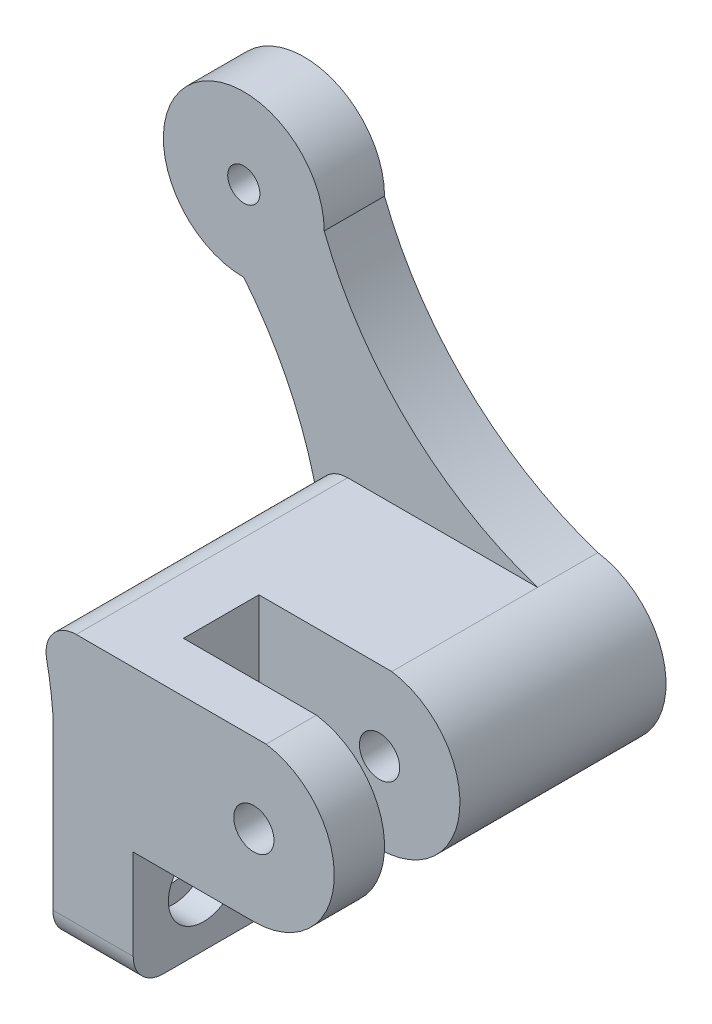
ISO-10303-21;
HEADER;
FILE_DESCRIPTION(('STEP AP214'),'2;1');
FILE_NAME('part.step','',(''),(''),'','','');
FILE_SCHEMA(('AUTOMOTIVE_DESIGN { 1 0 10303 214 1 1 1 1 }'));
ENDSEC;
DATA;
#1=APPLICATION_CONTEXT('core data for automotive mechanical design processes');
#2=APPLICATION_PROTOCOL_DEFINITION('international standard','automotive_design',2000,#1);
#3=PRODUCT_CONTEXT('',#1,'mechanical');
#4=PRODUCT('Part','Part','',(#3));
#5=PRODUCT_RELATED_PRODUCT_CATEGORY('part','',(#4));
#6=PRODUCT_DEFINITION_FORMATION('','',#4);
#7=PRODUCT_DEFINITION_CONTEXT('part definition',#1,'design');
#8=PRODUCT_DEFINITION('design','',#6,#7);
#9=PRODUCT_DEFINITION_SHAPE('','',#8);
#10=(LENGTH_UNIT() NAMED_UNIT(*) SI_UNIT(.MILLI.,.METRE.));
#11=(NAMED_UNIT(*) PLANE_ANGLE_UNIT() SI_UNIT($,.RADIAN.));
#12=(NAMED_UNIT(*) SI_UNIT($,.STERADIAN.) SOLID_ANGLE_UNIT());
#13=UNCERTAINTY_MEASURE_WITH_UNIT(LENGTH_MEASURE(1.E-05),#10,'distance_accuracy_value','');
#14=(GEOMETRIC_REPRESENTATION_CONTEXT(3) GLOBAL_UNCERTAINTY_ASSIGNED_CONTEXT((#13)) GLOBAL_UNIT_ASSIGNED_CONTEXT((#10,
#11,#12)) REPRESENTATION_CONTEXT('',''));
#15=CARTESIAN_POINT('',(0.,0.,0.));
#16=DIRECTION('',(0.,0.,1.));
#17=DIRECTION('',(1.,0.,0.));
#18=AXIS2_PLACEMENT_3D('',#15,#16,#17);
#19=CARTESIAN_POINT('',(0.,0.,6.));
#20=DIRECTION('',(0.,0.,-1.));
#21=DIRECTION('',(-1.,0.,0.));
#22=AXIS2_PLACEMENT_3D('',#19,#20,#21);
#23=CYLINDRICAL_SURFACE('',#22,2.);
#24=CARTESIAN_POINT('',(0.,0.,20.5));
#25=DIRECTION('',(0.,0.,1.));
#26=DIRECTION('',(1.,0.,0.));
#27=AXIS2_PLACEMENT_3D('',#24,#25,#26);
#28=CIRCLE('',#27,2.);
#29=CARTESIAN_POINT('',(2.,0.,20.5));
#30=VERTEX_POINT('',#29);
#31=EDGE_CURVE('E336',#30,#30,#28,.T.);
#32=ORIENTED_EDGE('',*,*,#31,.T.);
#33=EDGE_LOOP('',(#32));
#34=FACE_BOUND('',#33,.T.);
#35=CARTESIAN_POINT('',(0.,0.,4.));
#36=DIRECTION('',(0.,0.,-1.));
#37=DIRECTION('',(-1.,0.,0.));
#38=AXIS2_PLACEMENT_3D('',#35,#36,#37);
#39=CIRCLE('',#38,2.);
#40=CARTESIAN_POINT('',(-2.,0.,4.));
#41=VERTEX_POINT('',#40);
#42=EDGE_CURVE('E42',#41,#41,#39,.T.);
#43=ORIENTED_EDGE('',*,*,#42,.T.);
#44=EDGE_LOOP('',(#43));
#45=FACE_BOUND('',#44,.T.);
#46=ADVANCED_FACE('F38',(#34,#45),#23,.F.);
#47=CARTESIAN_POINT('',(-29.5,-14.,7.));
#48=DIRECTION('',(1.,0.,0.));
#49=DIRECTION('',(0.,0.,-1.));
#50=AXIS2_PLACEMENT_3D('',#47,#48,#49);
#51=CYLINDRICAL_SURFACE('',#50,1.6);
#52=CARTESIAN_POINT('',(-20.,-14.,7.));
#53=DIRECTION('',(1.,0.,0.));
#54=DIRECTION('',(0.,1.,0.));
#55=AXIS2_PLACEMENT_3D('',#52,#53,#54);
#56=CIRCLE('',#55,1.6);
#57=CARTESIAN_POINT('',(-20.,-12.4,7.));
#58=VERTEX_POINT('',#57);
#59=EDGE_CURVE('E264',#58,#58,#56,.T.);
#60=ORIENTED_EDGE('',*,*,#59,.F.);
#61=EDGE_LOOP('',(#60));
#62=FACE_BOUND('',#61,.T.);
#63=CARTESIAN_POINT('',(-15.,-14.,7.));
#64=DIRECTION('',(1.,0.,0.));
#65=DIRECTION('',(0.,0.,-1.));
#66=AXIS2_PLACEMENT_3D('',#63,#64,#65);
#67=CIRCLE('',#66,1.6);
#68=CARTESIAN_POINT('',(-15.,-14.,5.4));
#69=VERTEX_POINT('',#68);
#70=EDGE_CURVE('E261',#69,#69,#67,.F.);
#71=ORIENTED_EDGE('',*,*,#70,.F.);
#72=EDGE_LOOP('',(#71));
#73=FACE_BOUND('',#72,.T.);
#74=ADVANCED_FACE('F299',(#62,#73),#51,.F.);
#75=CARTESIAN_POINT('',(-29.5,-14.,26.));
#76=DIRECTION('',(1.,0.,0.));
#77=DIRECTION('',(0.,0.,-1.));
#78=AXIS2_PLACEMENT_3D('',#75,#76,#77);
#79=CYLINDRICAL_SURFACE('',#78,1.6);
#80=CARTESIAN_POINT('',(-20.,-14.,26.));
#81=DIRECTION('',(1.,0.,0.));
#82=DIRECTION('',(0.,1.,0.));
#83=AXIS2_PLACEMENT_3D('',#80,#81,#82);
#84=CIRCLE('',#83,1.6);
#85=CARTESIAN_POINT('',(-20.,-12.4,26.));
#86=VERTEX_POINT('',#85);
#87=EDGE_CURVE('E386',#86,#86,#84,.T.);
#88=ORIENTED_EDGE('',*,*,#87,.F.);
#89=EDGE_LOOP('',(#88));
#90=FACE_BOUND('',#89,.T.);
#91=CARTESIAN_POINT('',(-15.,-14.,26.));
#92=DIRECTION('',(1.,0.,0.));
#93=DIRECTION('',(0.,0.,-1.));
#94=AXIS2_PLACEMENT_3D('',#91,#92,#93);
#95=CIRCLE('',#94,1.6);
#96=CARTESIAN_POINT('',(-15.,-14.,24.4));
#97=VERTEX_POINT('',#96);
#98=EDGE_CURVE('E613',#97,#97,#95,.T.);
#99=ORIENTED_EDGE('',*,*,#98,.T.);
#100=EDGE_LOOP('',(#99));
#101=FACE_BOUND('',#100,.T.);
#102=ADVANCED_FACE('F306',(#90,#101),#79,.F.);
#103=CARTESIAN_POINT('',(0.,0.,6.));
#104=DIRECTION('',(0.,0.,-1.));
#105=DIRECTION('',(-1.,0.,0.));
#106=AXIS2_PLACEMENT_3D('',#103,#104,#105);
#107=CYLINDRICAL_SURFACE('',#106,8.);
#108=CARTESIAN_POINT('',(0.,0.,20.5));
#109=DIRECTION('',(0.,0.,1.));
#110=DIRECTION('',(1.,0.,0.));
#111=AXIS2_PLACEMENT_3D('',#108,#109,#110);
#112=CIRCLE('',#111,8.);
#113=CARTESIAN_POINT('',(0.,-8.,20.5));
#114=VERTEX_POINT('',#113);
#115=CARTESIAN_POINT('',(1.22471153990993,7.90569931403993,20.5));
#116=VERTEX_POINT('',#115);
#117=EDGE_CURVE('E154',#114,#116,#112,.T.);
#118=ORIENTED_EDGE('',*,*,#117,.F.);
#119=DIRECTION('',(0.,0.,-1.));
#120=VECTOR('',#119,1.);
#121=CARTESIAN_POINT('',(0.,-8.,6.));
#122=LINE('',#121,#120);
#123=CARTESIAN_POINT('',(0.,-8.,0.));
#124=VERTEX_POINT('',#123);
#125=EDGE_CURVE('E200',#114,#124,#122,.T.);
#126=ORIENTED_EDGE('',*,*,#125,.T.);
#127=CARTESIAN_POINT('',(0.,0.,0.));
#128=DIRECTION('',(0.,0.,1.));
#129=DIRECTION('',(1.,0.,0.));
#130=AXIS2_PLACEMENT_3D('',#127,#128,#129);
#131=CIRCLE('',#130,8.);
#132=CARTESIAN_POINT('',(1.22471153990993,7.90569931403993,0.));
#133=VERTEX_POINT('',#132);
#134=EDGE_CURVE('E189',#124,#133,#131,.T.);
#135=ORIENTED_EDGE('',*,*,#134,.T.);
#136=DIRECTION('',(0.,0.,-1.));
#137=VECTOR('',#136,1.);
#138=CARTESIAN_POINT('',(1.22471153990993,7.90569931403993,6.));
#139=LINE('',#138,#137);
#140=CARTESIAN_POINT('',(1.22471153990993,7.90569931403993,6.));
#141=VERTEX_POINT('',#140);
#142=EDGE_CURVE('E177',#141,#133,#139,.T.);
#143=ORIENTED_EDGE('',*,*,#142,.F.);
#144=DIRECTION('',(0.,0.,-1.));
#145=VECTOR('',#144,1.);
#146=CARTESIAN_POINT('',(1.22471153990993,7.90569931403993,33.));
#147=LINE('',#146,#145);
#148=EDGE_CURVE('E167',#116,#141,#147,.T.);
#149=ORIENTED_EDGE('',*,*,#148,.F.);
#150=EDGE_LOOP('',(#118,#126,#135,#143,#149));
#151=FACE_BOUND('',#150,.T.);
#152=ADVANCED_FACE('F175',(#151),#107,.T.);
#153=CARTESIAN_POINT('',(0.,-8.,6.));
#154=DIRECTION('',(0.,-1.,0.));
#155=DIRECTION('',(1.,0.,0.));
#156=AXIS2_PLACEMENT_3D('',#153,#154,#155);
#157=PLANE('',#156);
#158=ORIENTED_EDGE('',*,*,#125,.F.);
#159=DIRECTION('',(1.,0.,0.));
#160=VECTOR('',#159,1.);
#161=CARTESIAN_POINT('',(-12.,-8.,20.5));
#162=LINE('',#161,#160);
#163=CARTESIAN_POINT('',(-12.,-8.,20.5));
#164=VERTEX_POINT('',#163);
#165=EDGE_CURVE('E160',#164,#114,#162,.T.);
#166=ORIENTED_EDGE('',*,*,#165,.F.);
#167=DIRECTION('',(0.,0.,-1.));
#168=VECTOR('',#167,1.);
#169=CARTESIAN_POINT('',(-12.,-8.,6.));
#170=LINE('',#169,#168);
#171=CARTESIAN_POINT('',(-12.,-8.,0.));
#172=VERTEX_POINT('',#171);
#173=EDGE_CURVE('E223',#164,#172,#170,.T.);
#174=ORIENTED_EDGE('',*,*,#173,.T.);
#175=DIRECTION('',(-1.,0.,0.));
#176=VECTOR('',#175,1.);
#177=CARTESIAN_POINT('',(0.,-8.,0.));
#178=LINE('',#177,#176);
#179=EDGE_CURVE('E215',#124,#172,#178,.T.);
#180=ORIENTED_EDGE('',*,*,#179,.F.);
#181=EDGE_LOOP('',(#158,#166,#174,#180));
#182=FACE_BOUND('',#181,.T.);
#183=ADVANCED_FACE('F327',(#182),#157,.T.);
#184=CARTESIAN_POINT('',(0.,7.90569931403993,33.));
#185=DIRECTION('',(0.,1.,0.));
#186=DIRECTION('',(0.,0.,1.));
#187=AXIS2_PLACEMENT_3D('',#184,#185,#186);
#188=PLANE('',#187);
#189=DIRECTION('',(-1.,0.,0.));
#190=VECTOR('',#189,1.);
#191=CARTESIAN_POINT('',(0.,7.90569931403993,6.));
#192=LINE('',#191,#190);
#193=CARTESIAN_POINT('',(-17.6709656540799,7.90569931403993,6.));
#194=VERTEX_POINT('',#193);
#195=EDGE_CURVE('E182',#141,#194,#192,.T.);
#196=ORIENTED_EDGE('',*,*,#195,.T.);
#197=DIRECTION('',(0.,0.,1.));
#198=VECTOR('',#197,1.);
#199=CARTESIAN_POINT('',(-17.6709656540799,7.90569931403993,33.));
#200=LINE('',#199,#198);
#201=CARTESIAN_POINT('',(-17.6709656540799,7.90569931403993,33.));
#202=VERTEX_POINT('',#201);
#203=EDGE_CURVE('E54',#194,#202,#200,.T.);
#204=ORIENTED_EDGE('',*,*,#203,.T.);
#205=DIRECTION('',(1.,0.,0.));
#206=VECTOR('',#205,1.);
#207=CARTESIAN_POINT('',(0.,7.90569931403993,33.));
#208=LINE('',#207,#206);
#209=CARTESIAN_POINT('',(1.22471153990993,7.90569931403993,33.));
#210=VERTEX_POINT('',#209);
#211=EDGE_CURVE('E276',#202,#210,#208,.T.);
#212=ORIENTED_EDGE('',*,*,#211,.T.);
#213=CARTESIAN_POINT('',(1.22471153990993,7.90569931403993,28.));
#214=VERTEX_POINT('',#213);
#215=EDGE_CURVE('E178',#210,#214,#147,.T.);
#216=ORIENTED_EDGE('',*,*,#215,.T.);
#217=DIRECTION('',(-1.,0.,0.));
#218=VECTOR('',#217,1.);
#219=CARTESIAN_POINT('',(1.22471153990993,7.90569931403993,28.));
#220=LINE('',#219,#218);
#221=CARTESIAN_POINT('',(-12.,7.90569931403993,28.));
#222=VERTEX_POINT('',#221);
#223=EDGE_CURVE('E385',#214,#222,#220,.T.);
#224=ORIENTED_EDGE('',*,*,#223,.T.);
#225=DIRECTION('',(0.,0.,1.));
#226=VECTOR('',#225,1.);
#227=CARTESIAN_POINT('',(-12.,7.90569931403993,20.5));
#228=LINE('',#227,#226);
#229=CARTESIAN_POINT('',(-12.,7.90569931403993,20.5));
#230=VERTEX_POINT('',#229);
#231=EDGE_CURVE('E171',#230,#222,#228,.T.);
#232=ORIENTED_EDGE('',*,*,#231,.F.);
#233=DIRECTION('',(-1.,0.,0.));
#234=VECTOR('',#233,1.);
#235=CARTESIAN_POINT('',(1.22471153990993,7.90569931403993,20.5));
#236=LINE('',#235,#234);
#237=EDGE_CURVE('E157',#116,#230,#236,.T.);
#238=ORIENTED_EDGE('',*,*,#237,.F.);
#239=ORIENTED_EDGE('',*,*,#148,.T.);
#240=EDGE_LOOP('',(#196,#204,#212,#216,#224,#232,#238,#239));
#241=FACE_BOUND('',#240,.T.);
#242=ADVANCED_FACE('F166',(#241),#188,.T.);
#243=CARTESIAN_POINT('',(0.,-8.,33.));
#244=VERTEX_POINT('',#243);
#245=CARTESIAN_POINT('',(0.,-8.,28.));
#246=VERTEX_POINT('',#245);
#247=EDGE_CURVE('E220',#244,#246,#122,.T.);
#248=ORIENTED_EDGE('',*,*,#247,.T.);
#249=CARTESIAN_POINT('',(0.,0.,28.));
#250=DIRECTION('',(0.,0.,1.));
#251=DIRECTION('',(1.,0.,0.));
#252=AXIS2_PLACEMENT_3D('',#249,#250,#251);
#253=CIRCLE('',#252,8.);
#254=EDGE_CURVE('E382',#246,#214,#253,.T.);
#255=ORIENTED_EDGE('',*,*,#254,.T.);
#256=ORIENTED_EDGE('',*,*,#215,.F.);
#257=CARTESIAN_POINT('',(0.,0.,33.));
#258=DIRECTION('',(0.,0.,1.));
#259=DIRECTION('',(1.,0.,0.));
#260=AXIS2_PLACEMENT_3D('',#257,#258,#259);
#261=CIRCLE('',#260,8.);
#262=EDGE_CURVE('E179',#244,#210,#261,.T.);
#263=ORIENTED_EDGE('',*,*,#262,.F.);
#264=EDGE_LOOP('',(#248,#255,#256,#263));
#265=FACE_BOUND('',#264,.T.);
#266=ADVANCED_FACE('F397',(#265),#107,.T.);
#267=CARTESIAN_POINT('',(11.8724072045899,40.4088916002489,6.));
#268=DIRECTION('',(0.,0.,-1.));
#269=DIRECTION('',(-1.,0.,0.));
#270=AXIS2_PLACEMENT_3D('',#267,#268,#269);
#271=CYLINDRICAL_SURFACE('',#270,34.2027912861205);
#272=CARTESIAN_POINT('',(11.8724072045899,40.4088916002489,0.));
#273=DIRECTION('',(0.,0.,1.));
#274=DIRECTION('',(1.,0.,0.));
#275=AXIS2_PLACEMENT_3D('',#272,#273,#274);
#276=CIRCLE('',#275,34.2027912861205);
#277=CARTESIAN_POINT('',(-20.,28.,0.));
#278=VERTEX_POINT('',#277);
#279=EDGE_CURVE('E202',#278,#133,#276,.T.);
#280=ORIENTED_EDGE('',*,*,#279,.F.);
#281=DIRECTION('',(0.,0.,-1.));
#282=VECTOR('',#281,1.);
#283=CARTESIAN_POINT('',(-20.,28.,6.));
#284=LINE('',#283,#282);
#285=CARTESIAN_POINT('',(-20.,28.,6.));
#286=VERTEX_POINT('',#285);
#287=EDGE_CURVE('E239',#286,#278,#284,.T.);
#288=ORIENTED_EDGE('',*,*,#287,.F.);
#289=CARTESIAN_POINT('',(11.8724072045899,40.4088916002489,6.));
#290=DIRECTION('',(0.,0.,1.));
#291=DIRECTION('',(1.,0.,0.));
#292=AXIS2_PLACEMENT_3D('',#289,#290,#291);
#293=CIRCLE('',#292,34.2027912861205);
#294=EDGE_CURVE('E190',#286,#141,#293,.T.);
#295=ORIENTED_EDGE('',*,*,#294,.T.);
#296=ORIENTED_EDGE('',*,*,#142,.T.);
#297=EDGE_LOOP('',(#280,#288,#295,#296));
#298=FACE_BOUND('',#297,.T.);
#299=ADVANCED_FACE('F399',(#298),#271,.F.);
#300=CARTESIAN_POINT('',(-28.,28.,6.));
#301=DIRECTION('',(0.,0.,-1.));
#302=DIRECTION('',(-1.,0.,0.));
#303=AXIS2_PLACEMENT_3D('',#300,#301,#302);
#304=CYLINDRICAL_SURFACE('',#303,8.);
#305=CARTESIAN_POINT('',(-28.,28.,0.));
#306=DIRECTION('',(0.,0.,1.));
#307=DIRECTION('',(1.,0.,0.));
#308=AXIS2_PLACEMENT_3D('',#305,#306,#307);
#309=CIRCLE('',#308,8.);
#310=CARTESIAN_POINT('',(-28.,20.,0.));
#311=VERTEX_POINT('',#310);
#312=EDGE_CURVE('E205',#278,#311,#309,.T.);
#313=ORIENTED_EDGE('',*,*,#312,.T.);
#314=DIRECTION('',(0.,0.,-1.));
#315=VECTOR('',#314,1.);
#316=CARTESIAN_POINT('',(-28.,20.,6.));
#317=LINE('',#316,#315);
#318=CARTESIAN_POINT('',(-28.,20.,6.));
#319=VERTEX_POINT('',#318);
#320=EDGE_CURVE('E236',#319,#311,#317,.T.);
#321=ORIENTED_EDGE('',*,*,#320,.F.);
#322=CARTESIAN_POINT('',(-28.,28.,6.));
#323=DIRECTION('',(0.,0.,1.));
#324=DIRECTION('',(1.,0.,0.));
#325=AXIS2_PLACEMENT_3D('',#322,#323,#324);
#326=CIRCLE('',#325,8.);
#327=EDGE_CURVE('E192',#286,#319,#326,.T.);
#328=ORIENTED_EDGE('',*,*,#327,.F.);
#329=ORIENTED_EDGE('',*,*,#287,.T.);
#330=EDGE_LOOP('',(#313,#321,#328,#329));
#331=FACE_BOUND('',#330,.T.);
#332=ADVANCED_FACE('F404',(#331),#304,.T.);
#333=CARTESIAN_POINT('',(-56.4146166944193,-2.96584667776772,6.));
#334=DIRECTION('',(0.,0.,-1.));
#335=DIRECTION('',(-1.,0.,0.));
#336=AXIS2_PLACEMENT_3D('',#333,#334,#335);
#337=CYLINDRICAL_SURFACE('',#336,36.535196119872);
#338=CARTESIAN_POINT('',(-56.4146166944193,-2.96584667776772,33.));
#339=DIRECTION('',(0.,0.,1.));
#340=DIRECTION('',(1.,0.,0.));
#341=AXIS2_PLACEMENT_3D('',#338,#339,#340);
#342=CIRCLE('',#341,36.535196119872);
#343=CARTESIAN_POINT('',(-20.6109018256016,4.30839260272825,33.));
#344=VERTEX_POINT('',#343);
#345=CARTESIAN_POINT('',(-20.,0.,33.));
#346=VERTEX_POINT('',#345);
#347=EDGE_CURVE('E274',#344,#346,#342,.F.);
#348=ORIENTED_EDGE('',*,*,#347,.F.);
#349=DIRECTION('',(0.,0.,-1.));
#350=VECTOR('',#349,1.);
#351=CARTESIAN_POINT('',(-20.6109018256016,4.30839260272825,6.));
#352=LINE('',#351,#350);
#353=CARTESIAN_POINT('',(-20.6109018256016,4.30839260272825,6.));
#354=VERTEX_POINT('',#353);
#355=EDGE_CURVE('E260',#344,#354,#352,.T.);
#356=ORIENTED_EDGE('',*,*,#355,.T.);
#357=CARTESIAN_POINT('',(-56.4146166944193,-2.96584667776772,6.));
#358=DIRECTION('',(0.,0.,1.));
#359=DIRECTION('',(1.,0.,0.));
#360=AXIS2_PLACEMENT_3D('',#357,#358,#359);
#361=CIRCLE('',#360,36.535196119872);
#362=EDGE_CURVE('E195',#319,#354,#361,.F.);
#363=ORIENTED_EDGE('',*,*,#362,.F.);
#364=ORIENTED_EDGE('',*,*,#320,.T.);
#365=CARTESIAN_POINT('',(-56.4146166944193,-2.96584667776772,0.));
#366=DIRECTION('',(0.,0.,1.));
#367=DIRECTION('',(1.,0.,0.));
#368=AXIS2_PLACEMENT_3D('',#365,#366,#367);
#369=CIRCLE('',#368,36.535196119872);
#370=CARTESIAN_POINT('',(-20.,0.,0.));
#371=VERTEX_POINT('',#370);
#372=EDGE_CURVE('E207',#311,#371,#369,.F.);
#373=ORIENTED_EDGE('',*,*,#372,.T.);
#374=DIRECTION('',(0.,0.,-1.));
#375=VECTOR('',#374,1.);
#376=CARTESIAN_POINT('',(-20.,0.,6.));
#377=LINE('',#376,#375);
#378=EDGE_CURVE('E233',#346,#371,#377,.T.);
#379=ORIENTED_EDGE('',*,*,#378,.F.);
#380=EDGE_LOOP('',(#348,#356,#363,#364,#373,#379));
#381=FACE_BOUND('',#380,.T.);
#382=ADVANCED_FACE('F280',(#381),#337,.F.);
#383=CARTESIAN_POINT('',(-20.,0.,6.));
#384=DIRECTION('',(1.,0.,0.));
#385=DIRECTION('',(0.,1.,0.));
#386=AXIS2_PLACEMENT_3D('',#383,#384,#385);
#387=PLANE('',#386);
#388=ORIENTED_EDGE('',*,*,#87,.T.);
#389=EDGE_LOOP('',(#388));
#390=FACE_BOUND('',#389,.T.);
#391=ORIENTED_EDGE('',*,*,#59,.T.);
#392=EDGE_LOOP('',(#391));
#393=FACE_BOUND('',#392,.T.);
#394=DIRECTION('',(0.,0.,-1.));
#395=VECTOR('',#394,1.);
#396=CARTESIAN_POINT('',(-20.,-20.,6.));
#397=LINE('',#396,#395);
#398=CARTESIAN_POINT('',(-20.,-20.,30.));
#399=VERTEX_POINT('',#398);
#400=CARTESIAN_POINT('',(-20.,-20.,3.));
#401=VERTEX_POINT('',#400);
#402=EDGE_CURVE('E230',#399,#401,#397,.T.);
#403=ORIENTED_EDGE('',*,*,#402,.F.);
#404=CARTESIAN_POINT('',(-20.,-17.,30.));
#405=DIRECTION('',(1.,0.,0.));
#406=DIRECTION('',(0.,1.,0.));
#407=AXIS2_PLACEMENT_3D('',#404,#405,#406);
#408=CIRCLE('',#407,3.);
#409=CARTESIAN_POINT('',(-20.,-17.,33.));
#410=VERTEX_POINT('',#409);
#411=EDGE_CURVE('E249',#399,#410,#408,.F.);
#412=ORIENTED_EDGE('',*,*,#411,.T.);
#413=DIRECTION('',(0.,-1.,0.));
#414=VECTOR('',#413,1.);
#415=CARTESIAN_POINT('',(-20.,0.,33.));
#416=LINE('',#415,#414);
#417=EDGE_CURVE('E283',#346,#410,#416,.T.);
#418=ORIENTED_EDGE('',*,*,#417,.F.);
#419=ORIENTED_EDGE('',*,*,#378,.T.);
#420=DIRECTION('',(0.,-1.,0.));
#421=VECTOR('',#420,1.);
#422=CARTESIAN_POINT('',(-20.,0.,0.));
#423=LINE('',#422,#421);
#424=CARTESIAN_POINT('',(-20.,-17.,0.));
#425=VERTEX_POINT('',#424);
#426=EDGE_CURVE('E209',#371,#425,#423,.T.);
#427=ORIENTED_EDGE('',*,*,#426,.T.);
#428=CARTESIAN_POINT('',(-20.,-17.,3.));
#429=DIRECTION('',(1.,0.,0.));
#430=DIRECTION('',(0.,1.,0.));
#431=AXIS2_PLACEMENT_3D('',#428,#429,#430);
#432=CIRCLE('',#431,3.);
#433=EDGE_CURVE('E247',#425,#401,#432,.F.);
#434=ORIENTED_EDGE('',*,*,#433,.T.);
#435=EDGE_LOOP('',(#403,#412,#418,#419,#427,#434));
#436=FACE_BOUND('',#435,.T.);
#437=ADVANCED_FACE('F363',(#390,#393,#436),#387,.F.);
#438=CARTESIAN_POINT('',(0.,-20.,6.));
#439=DIRECTION('',(0.,-1.,0.));
#440=DIRECTION('',(1.,0.,0.));
#441=AXIS2_PLACEMENT_3D('',#438,#439,#440);
#442=PLANE('',#441);
#443=DIRECTION('',(0.,0.,-1.));
#444=VECTOR('',#443,1.);
#445=CARTESIAN_POINT('',(-12.,-20.,6.));
#446=LINE('',#445,#444);
#447=CARTESIAN_POINT('',(-12.,-20.,30.));
#448=VERTEX_POINT('',#447);
#449=CARTESIAN_POINT('',(-12.,-20.,3.));
#450=VERTEX_POINT('',#449);
#451=EDGE_CURVE('E227',#448,#450,#446,.T.);
#452=ORIENTED_EDGE('',*,*,#451,.F.);
#453=DIRECTION('',(-1.,0.,0.));
#454=VECTOR('',#453,1.);
#455=CARTESIAN_POINT('',(0.,-20.,30.));
#456=LINE('',#455,#454);
#457=EDGE_CURVE('E244',#448,#399,#456,.T.);
#458=ORIENTED_EDGE('',*,*,#457,.T.);
#459=ORIENTED_EDGE('',*,*,#402,.T.);
#460=DIRECTION('',(-1.,0.,0.));
#461=VECTOR('',#460,1.);
#462=CARTESIAN_POINT('',(-12.,-20.,3.));
#463=LINE('',#462,#461);
#464=EDGE_CURVE('E242',#401,#450,#463,.F.);
#465=ORIENTED_EDGE('',*,*,#464,.T.);
#466=EDGE_LOOP('',(#452,#458,#459,#465));
#467=FACE_BOUND('',#466,.T.);
#468=ADVANCED_FACE('F360',(#467),#442,.T.);
#469=CARTESIAN_POINT('',(-12.,0.,6.));
#470=DIRECTION('',(1.,0.,0.));
#471=DIRECTION('',(0.,0.,-1.));
#472=AXIS2_PLACEMENT_3D('',#469,#470,#471);
#473=PLANE('',#472);
#474=CARTESIAN_POINT('',(-12.,-14.,7.));
#475=DIRECTION('',(1.,0.,0.));
#476=DIRECTION('',(0.,0.,-1.));
#477=AXIS2_PLACEMENT_3D('',#474,#475,#476);
#478=CIRCLE('',#477,3.5);
#479=CARTESIAN_POINT('',(-12.,-14.,3.5));
#480=VERTEX_POINT('',#479);
#481=EDGE_CURVE('E619',#480,#480,#478,.T.);
#482=ORIENTED_EDGE('',*,*,#481,.F.);
#483=EDGE_LOOP('',(#482));
#484=FACE_BOUND('',#483,.T.);
#485=CARTESIAN_POINT('',(-12.,-14.,26.));
#486=DIRECTION('',(1.,0.,0.));
#487=DIRECTION('',(0.,0.,-1.));
#488=AXIS2_PLACEMENT_3D('',#485,#486,#487);
#489=CIRCLE('',#488,3.5);
#490=CARTESIAN_POINT('',(-12.,-14.,22.5));
#491=VERTEX_POINT('',#490);
#492=EDGE_CURVE('E625',#491,#491,#489,.T.);
#493=ORIENTED_EDGE('',*,*,#492,.F.);
#494=EDGE_LOOP('',(#493));
#495=FACE_BOUND('',#494,.T.);
#496=DIRECTION('',(0.,-1.,0.));
#497=VECTOR('',#496,1.);
#498=CARTESIAN_POINT('',(-12.,0.,33.));
#499=LINE('',#498,#497);
#500=CARTESIAN_POINT('',(-12.,-8.,33.));
#501=VERTEX_POINT('',#500);
#502=CARTESIAN_POINT('',(-12.,-17.,33.));
#503=VERTEX_POINT('',#502);
#504=EDGE_CURVE('E343',#501,#503,#499,.T.);
#505=ORIENTED_EDGE('',*,*,#504,.T.);
#506=CARTESIAN_POINT('',(-12.,-17.,30.));
#507=DIRECTION('',(1.,0.,0.));
#508=DIRECTION('',(0.,0.,-1.));
#509=AXIS2_PLACEMENT_3D('',#506,#507,#508);
#510=CIRCLE('',#509,3.);
#511=EDGE_CURVE('E255',#503,#448,#510,.T.);
#512=ORIENTED_EDGE('',*,*,#511,.T.);
#513=ORIENTED_EDGE('',*,*,#451,.T.);
#514=CARTESIAN_POINT('',(-12.,-17.,3.));
#515=DIRECTION('',(1.,0.,0.));
#516=DIRECTION('',(0.,0.,-1.));
#517=AXIS2_PLACEMENT_3D('',#514,#515,#516);
#518=CIRCLE('',#517,3.);
#519=CARTESIAN_POINT('',(-12.,-17.,0.));
#520=VERTEX_POINT('',#519);
#521=EDGE_CURVE('E253',#450,#520,#518,.T.);
#522=ORIENTED_EDGE('',*,*,#521,.T.);
#523=DIRECTION('',(0.,-1.,0.));
#524=VECTOR('',#523,1.);
#525=CARTESIAN_POINT('',(-12.,0.,0.));
#526=LINE('',#525,#524);
#527=EDGE_CURVE('E212',#172,#520,#526,.T.);
#528=ORIENTED_EDGE('',*,*,#527,.F.);
#529=ORIENTED_EDGE('',*,*,#173,.F.);
#530=DIRECTION('',(0.,-1.,0.));
#531=VECTOR('',#530,1.);
#532=CARTESIAN_POINT('',(-12.,-8.,20.5));
#533=LINE('',#532,#531);
#534=EDGE_CURVE('E172',#230,#164,#533,.T.);
#535=ORIENTED_EDGE('',*,*,#534,.F.);
#536=ORIENTED_EDGE('',*,*,#231,.T.);
#537=DIRECTION('',(0.,-1.,0.));
#538=VECTOR('',#537,1.);
#539=CARTESIAN_POINT('',(-12.,-8.,28.));
#540=LINE('',#539,#538);
#541=CARTESIAN_POINT('',(-12.,-8.,28.));
#542=VERTEX_POINT('',#541);
#543=EDGE_CURVE('E388',#222,#542,#540,.T.);
#544=ORIENTED_EDGE('',*,*,#543,.T.);
#545=EDGE_CURVE('E224',#501,#542,#170,.T.);
#546=ORIENTED_EDGE('',*,*,#545,.F.);
#547=EDGE_LOOP('',(#505,#512,#513,#522,#528,#529,#535,#536,#544,#546));
#548=FACE_BOUND('',#547,.T.);
#549=ADVANCED_FACE('F324',(#484,#495,#548),#473,.T.);
#550=DIRECTION('',(1.,0.,0.));
#551=VECTOR('',#550,1.);
#552=CARTESIAN_POINT('',(-12.,-8.,28.));
#553=LINE('',#552,#551);
#554=EDGE_CURVE('E164',#542,#246,#553,.T.);
#555=ORIENTED_EDGE('',*,*,#554,.T.);
#556=ORIENTED_EDGE('',*,*,#247,.F.);
#557=DIRECTION('',(-1.,0.,0.));
#558=VECTOR('',#557,1.);
#559=CARTESIAN_POINT('',(0.,-8.,33.));
#560=LINE('',#559,#558);
#561=EDGE_CURVE('E184',#244,#501,#560,.T.);
#562=ORIENTED_EDGE('',*,*,#561,.T.);
#563=ORIENTED_EDGE('',*,*,#545,.T.);
#564=EDGE_LOOP('',(#555,#556,#562,#563));
#565=FACE_BOUND('',#564,.T.);
#566=ADVANCED_FACE('F315',(#565),#157,.T.);
#567=CARTESIAN_POINT('',(0.,0.,28.));
#568=DIRECTION('',(0.,0.,1.));
#569=DIRECTION('',(1.,0.,0.));
#570=AXIS2_PLACEMENT_3D('',#567,#568,#569);
#571=CIRCLE('',#570,2.);
#572=CARTESIAN_POINT('',(2.,0.,28.));
#573=VERTEX_POINT('',#572);
#574=EDGE_CURVE('E331',#573,#573,#571,.T.);
#575=ORIENTED_EDGE('',*,*,#574,.F.);
#576=EDGE_LOOP('',(#575));
#577=FACE_BOUND('',#576,.T.);
#578=CARTESIAN_POINT('',(0.,0.,33.));
#579=DIRECTION('',(0.,0.,1.));
#580=DIRECTION('',(1.,0.,0.));
#581=AXIS2_PLACEMENT_3D('',#578,#579,#580);
#582=CIRCLE('',#581,2.);
#583=CARTESIAN_POINT('',(2.,0.,33.));
#584=VERTEX_POINT('',#583);
#585=EDGE_CURVE('E334',#584,#584,#582,.T.);
#586=ORIENTED_EDGE('',*,*,#585,.T.);
#587=EDGE_LOOP('',(#586));
#588=FACE_BOUND('',#587,.T.);
#589=ADVANCED_FACE('F302',(#577,#588),#23,.F.);
#590=CARTESIAN_POINT('',(-28.,28.,6.));
#591=DIRECTION('',(0.,0.,-1.));
#592=DIRECTION('',(-1.,0.,0.));
#593=AXIS2_PLACEMENT_3D('',#590,#591,#592);
#594=CYLINDRICAL_SURFACE('',#593,1.6);
#595=CARTESIAN_POINT('',(-28.,28.,6.));
#596=DIRECTION('',(0.,0.,1.));
#597=DIRECTION('',(1.,0.,0.));
#598=AXIS2_PLACEMENT_3D('',#595,#596,#597);
#599=CIRCLE('',#598,1.6);
#600=CARTESIAN_POINT('',(-26.4,28.,6.));
#601=VERTEX_POINT('',#600);
#602=EDGE_CURVE('E197',#601,#601,#599,.T.);
#603=ORIENTED_EDGE('',*,*,#602,.T.);
#604=EDGE_LOOP('',(#603));
#605=FACE_BOUND('',#604,.T.);
#606=CARTESIAN_POINT('',(-28.,28.,0.));
#607=DIRECTION('',(0.,0.,1.));
#608=DIRECTION('',(1.,0.,0.));
#609=AXIS2_PLACEMENT_3D('',#606,#607,#608);
#610=CIRCLE('',#609,1.6);
#611=CARTESIAN_POINT('',(-26.4,28.,0.));
#612=VERTEX_POINT('',#611);
#613=EDGE_CURVE('E193',#612,#612,#610,.T.);
#614=ORIENTED_EDGE('',*,*,#613,.F.);
#615=EDGE_LOOP('',(#614));
#616=FACE_BOUND('',#615,.T.);
#617=ADVANCED_FACE('F314',(#605,#616),#594,.F.);
#618=CARTESIAN_POINT('',(0.,0.,6.));
#619=DIRECTION('',(0.,0.,1.));
#620=DIRECTION('',(1.,0.,0.));
#621=AXIS2_PLACEMENT_3D('',#618,#619,#620);
#622=PLANE('',#621);
#623=ORIENTED_EDGE('',*,*,#195,.F.);
#624=ORIENTED_EDGE('',*,*,#294,.F.);
#625=ORIENTED_EDGE('',*,*,#327,.T.);
#626=ORIENTED_EDGE('',*,*,#362,.T.);
#627=CARTESIAN_POINT('',(-17.6709656540799,4.90569931403993,6.));
#628=DIRECTION('',(0.,0.,1.));
#629=DIRECTION('',(1.,0.,0.));
#630=AXIS2_PLACEMENT_3D('',#627,#628,#629);
#631=CIRCLE('',#630,3.);
#632=EDGE_CURVE('E11',#354,#194,#631,.F.);
#633=ORIENTED_EDGE('',*,*,#632,.T.);
#634=EDGE_LOOP('',(#623,#624,#625,#626,#633));
#635=FACE_BOUND('',#634,.T.);
#636=ORIENTED_EDGE('',*,*,#602,.F.);
#637=EDGE_LOOP('',(#636));
#638=FACE_BOUND('',#637,.T.);
#639=ADVANCED_FACE('F321',(#635,#638),#622,.T.);
#640=CARTESIAN_POINT('',(0.,0.,0.));
#641=DIRECTION('',(0.,0.,1.));
#642=DIRECTION('',(1.,0.,0.));
#643=AXIS2_PLACEMENT_3D('',#640,#641,#642);
#644=PLANE('',#643);
#645=CARTESIAN_POINT('',(0.,0.,0.));
#646=DIRECTION('',(0.,0.,-1.));
#647=DIRECTION('',(-1.,0.,0.));
#648=AXIS2_PLACEMENT_3D('',#645,#646,#647);
#649=CIRCLE('',#648,3.5);
#650=CARTESIAN_POINT('',(-3.5,0.,0.));
#651=VERTEX_POINT('',#650);
#652=EDGE_CURVE('E611',#651,#651,#649,.T.);
#653=ORIENTED_EDGE('',*,*,#652,.F.);
#654=EDGE_LOOP('',(#653));
#655=FACE_BOUND('',#654,.T.);
#656=ORIENTED_EDGE('',*,*,#527,.T.);
#657=DIRECTION('',(-1.,0.,0.));
#658=VECTOR('',#657,1.);
#659=CARTESIAN_POINT('',(-20.,-17.,0.));
#660=LINE('',#659,#658);
#661=EDGE_CURVE('E257',#520,#425,#660,.T.);
#662=ORIENTED_EDGE('',*,*,#661,.T.);
#663=ORIENTED_EDGE('',*,*,#426,.F.);
#664=ORIENTED_EDGE('',*,*,#372,.F.);
#665=ORIENTED_EDGE('',*,*,#312,.F.);
#666=ORIENTED_EDGE('',*,*,#279,.T.);
#667=ORIENTED_EDGE('',*,*,#134,.F.);
#668=ORIENTED_EDGE('',*,*,#179,.T.);
#669=EDGE_LOOP('',(#656,#662,#663,#664,#665,#666,#667,#668));
#670=FACE_BOUND('',#669,.T.);
#671=ORIENTED_EDGE('',*,*,#613,.T.);
#672=EDGE_LOOP('',(#671));
#673=FACE_BOUND('',#672,.T.);
#674=ADVANCED_FACE('F370',(#655,#670,#673),#644,.F.);
#675=CARTESIAN_POINT('',(0.,0.,33.));
#676=DIRECTION('',(0.,0.,1.));
#677=DIRECTION('',(1.,0.,0.));
#678=AXIS2_PLACEMENT_3D('',#675,#676,#677);
#679=PLANE('',#678);
#680=ORIENTED_EDGE('',*,*,#585,.F.);
#681=EDGE_LOOP('',(#680));
#682=FACE_BOUND('',#681,.T.);
#683=ORIENTED_EDGE('',*,*,#211,.F.);
#684=CARTESIAN_POINT('',(-17.6709656540799,4.90569931403993,33.));
#685=DIRECTION('',(0.,0.,1.));
#686=DIRECTION('',(1.,0.,0.));
#687=AXIS2_PLACEMENT_3D('',#684,#685,#686);
#688=CIRCLE('',#687,3.);
#689=EDGE_CURVE('E47',#202,#344,#688,.T.);
#690=ORIENTED_EDGE('',*,*,#689,.T.);
#691=ORIENTED_EDGE('',*,*,#347,.T.);
#692=ORIENTED_EDGE('',*,*,#417,.T.);
#693=DIRECTION('',(-1.,0.,0.));
#694=VECTOR('',#693,1.);
#695=CARTESIAN_POINT('',(0.,-17.,33.));
#696=LINE('',#695,#694);
#697=EDGE_CURVE('E251',#410,#503,#696,.F.);
#698=ORIENTED_EDGE('',*,*,#697,.T.);
#699=ORIENTED_EDGE('',*,*,#504,.F.);
#700=ORIENTED_EDGE('',*,*,#561,.F.);
#701=ORIENTED_EDGE('',*,*,#262,.T.);
#702=EDGE_LOOP('',(#683,#690,#691,#692,#698,#699,#700,#701));
#703=FACE_BOUND('',#702,.T.);
#704=ADVANCED_FACE('F272',(#682,#703),#679,.T.);
#705=CARTESIAN_POINT('',(0.,0.,20.5));
#706=DIRECTION('',(0.,0.,1.));
#707=DIRECTION('',(1.,0.,0.));
#708=AXIS2_PLACEMENT_3D('',#705,#706,#707);
#709=PLANE('',#708);
#710=ORIENTED_EDGE('',*,*,#31,.F.);
#711=EDGE_LOOP('',(#710));
#712=FACE_BOUND('',#711,.T.);
#713=ORIENTED_EDGE('',*,*,#117,.T.);
#714=ORIENTED_EDGE('',*,*,#237,.T.);
#715=ORIENTED_EDGE('',*,*,#534,.T.);
#716=ORIENTED_EDGE('',*,*,#165,.T.);
#717=EDGE_LOOP('',(#713,#714,#715,#716));
#718=FACE_BOUND('',#717,.T.);
#719=ADVANCED_FACE('F156',(#712,#718),#709,.T.);
#720=CARTESIAN_POINT('',(0.,0.,28.));
#721=DIRECTION('',(0.,0.,1.));
#722=DIRECTION('',(1.,0.,0.));
#723=AXIS2_PLACEMENT_3D('',#720,#721,#722);
#724=PLANE('',#723);
#725=ORIENTED_EDGE('',*,*,#574,.T.);
#726=EDGE_LOOP('',(#725));
#727=FACE_BOUND('',#726,.T.);
#728=ORIENTED_EDGE('',*,*,#254,.F.);
#729=ORIENTED_EDGE('',*,*,#554,.F.);
#730=ORIENTED_EDGE('',*,*,#543,.F.);
#731=ORIENTED_EDGE('',*,*,#223,.F.);
#732=EDGE_LOOP('',(#728,#729,#730,#731));
#733=FACE_BOUND('',#732,.T.);
#734=ADVANCED_FACE('F391',(#727,#733),#724,.F.);
#735=CARTESIAN_POINT('',(0.,-17.,30.));
#736=DIRECTION('',(-1.,0.,0.));
#737=DIRECTION('',(0.,-1.,0.));
#738=AXIS2_PLACEMENT_3D('',#735,#736,#737);
#739=CYLINDRICAL_SURFACE('',#738,3.);
#740=ORIENTED_EDGE('',*,*,#511,.F.);
#741=ORIENTED_EDGE('',*,*,#697,.F.);
#742=ORIENTED_EDGE('',*,*,#411,.F.);
#743=ORIENTED_EDGE('',*,*,#457,.F.);
#744=EDGE_LOOP('',(#740,#741,#742,#743));
#745=FACE_BOUND('',#744,.T.);
#746=ADVANCED_FACE('F357',(#745),#739,.T.);
#747=CARTESIAN_POINT('',(0.,-17.,3.));
#748=DIRECTION('',(1.,0.,0.));
#749=DIRECTION('',(0.,1.,0.));
#750=AXIS2_PLACEMENT_3D('',#747,#748,#749);
#751=CYLINDRICAL_SURFACE('',#750,3.);
#752=ORIENTED_EDGE('',*,*,#521,.F.);
#753=ORIENTED_EDGE('',*,*,#464,.F.);
#754=ORIENTED_EDGE('',*,*,#433,.F.);
#755=ORIENTED_EDGE('',*,*,#661,.F.);
#756=EDGE_LOOP('',(#752,#753,#754,#755));
#757=FACE_BOUND('',#756,.T.);
#758=ADVANCED_FACE('F368',(#757),#751,.T.);
#759=CARTESIAN_POINT('',(-15.,-14.,26.));
#760=DIRECTION('',(1.,0.,0.));
#761=DIRECTION('',(0.,0.,-1.));
#762=AXIS2_PLACEMENT_3D('',#759,#760,#761);
#763=CYLINDRICAL_SURFACE('',#762,3.5);
#764=CARTESIAN_POINT('',(-15.,-14.,26.));
#765=DIRECTION('',(1.,0.,0.));
#766=DIRECTION('',(0.,0.,-1.));
#767=AXIS2_PLACEMENT_3D('',#764,#765,#766);
#768=CIRCLE('',#767,3.5);
#769=CARTESIAN_POINT('',(-15.,-14.,22.5));
#770=VERTEX_POINT('',#769);
#771=EDGE_CURVE('E622',#770,#770,#768,.T.);
#772=ORIENTED_EDGE('',*,*,#771,.F.);
#773=EDGE_LOOP('',(#772));
#774=FACE_BOUND('',#773,.T.);
#775=ORIENTED_EDGE('',*,*,#492,.T.);
#776=EDGE_LOOP('',(#775));
#777=FACE_BOUND('',#776,.T.);
#778=ADVANCED_FACE('F420',(#774,#777),#763,.F.);
#779=CARTESIAN_POINT('',(-15.,-14.,26.));
#780=DIRECTION('',(1.,0.,0.));
#781=DIRECTION('',(0.,0.,-1.));
#782=AXIS2_PLACEMENT_3D('',#779,#780,#781);
#783=PLANE('',#782);
#784=ORIENTED_EDGE('',*,*,#98,.F.);
#785=EDGE_LOOP('',(#784));
#786=FACE_BOUND('',#785,.T.);
#787=ORIENTED_EDGE('',*,*,#771,.T.);
#788=EDGE_LOOP('',(#787));
#789=FACE_BOUND('',#788,.T.);
#790=ADVANCED_FACE('F523',(#786,#789),#783,.T.);
#791=CARTESIAN_POINT('',(-15.,-14.,7.));
#792=DIRECTION('',(1.,0.,0.));
#793=DIRECTION('',(0.,0.,-1.));
#794=AXIS2_PLACEMENT_3D('',#791,#792,#793);
#795=PLANE('',#794);
#796=CARTESIAN_POINT('',(-15.,-14.,7.));
#797=DIRECTION('',(1.,0.,0.));
#798=DIRECTION('',(0.,0.,-1.));
#799=AXIS2_PLACEMENT_3D('',#796,#797,#798);
#800=CIRCLE('',#799,3.5);
#801=CARTESIAN_POINT('',(-15.,-14.,3.5));
#802=VERTEX_POINT('',#801);
#803=EDGE_CURVE('E265',#802,#802,#800,.T.);
#804=ORIENTED_EDGE('',*,*,#803,.T.);
#805=EDGE_LOOP('',(#804));
#806=FACE_BOUND('',#805,.T.);
#807=ORIENTED_EDGE('',*,*,#70,.T.);
#808=EDGE_LOOP('',(#807));
#809=FACE_BOUND('',#808,.T.);
#810=ADVANCED_FACE('F295',(#806,#809),#795,.T.);
#811=CARTESIAN_POINT('',(-15.,-14.,7.));
#812=DIRECTION('',(1.,0.,0.));
#813=DIRECTION('',(0.,0.,-1.));
#814=AXIS2_PLACEMENT_3D('',#811,#812,#813);
#815=CYLINDRICAL_SURFACE('',#814,3.5);
#816=ORIENTED_EDGE('',*,*,#803,.F.);
#817=EDGE_LOOP('',(#816));
#818=FACE_BOUND('',#817,.T.);
#819=ORIENTED_EDGE('',*,*,#481,.T.);
#820=EDGE_LOOP('',(#819));
#821=FACE_BOUND('',#820,.T.);
#822=ADVANCED_FACE('F287',(#818,#821),#815,.F.);
#823=CARTESIAN_POINT('',(-17.6709656540799,4.90569931403993,6.));
#824=DIRECTION('',(0.,0.,-1.));
#825=DIRECTION('',(-1.,0.,0.));
#826=AXIS2_PLACEMENT_3D('',#823,#824,#825);
#827=CYLINDRICAL_SURFACE('',#826,3.);
#828=ORIENTED_EDGE('',*,*,#689,.F.);
#829=ORIENTED_EDGE('',*,*,#203,.F.);
#830=ORIENTED_EDGE('',*,*,#632,.F.);
#831=ORIENTED_EDGE('',*,*,#355,.F.);
#832=EDGE_LOOP('',(#828,#829,#830,#831));
#833=FACE_BOUND('',#832,.T.);
#834=ADVANCED_FACE('F40',(#833),#827,.T.);
#835=CARTESIAN_POINT('',(0.,0.,4.));
#836=DIRECTION('',(0.,0.,-1.));
#837=DIRECTION('',(-1.,0.,0.));
#838=AXIS2_PLACEMENT_3D('',#835,#836,#837);
#839=CYLINDRICAL_SURFACE('',#838,3.5);
#840=CARTESIAN_POINT('',(0.,0.,4.));
#841=DIRECTION('',(0.,0.,-1.));
#842=DIRECTION('',(-1.,0.,0.));
#843=AXIS2_PLACEMENT_3D('',#840,#841,#842);
#844=CIRCLE('',#843,3.5);
#845=CARTESIAN_POINT('',(-3.5,0.,4.));
#846=VERTEX_POINT('',#845);
#847=EDGE_CURVE('E610',#846,#846,#844,.T.);
#848=ORIENTED_EDGE('',*,*,#847,.F.);
#849=EDGE_LOOP('',(#848));
#850=FACE_BOUND('',#849,.T.);
#851=ORIENTED_EDGE('',*,*,#652,.T.);
#852=EDGE_LOOP('',(#851));
#853=FACE_BOUND('',#852,.T.);
#854=ADVANCED_FACE('F286',(#850,#853),#839,.F.);
#855=CARTESIAN_POINT('',(0.,0.,4.));
#856=DIRECTION('',(0.,0.,-1.));
#857=DIRECTION('',(-1.,0.,0.));
#858=AXIS2_PLACEMENT_3D('',#855,#856,#857);
#859=PLANE('',#858);
#860=ORIENTED_EDGE('',*,*,#42,.F.);
#861=EDGE_LOOP('',(#860));
#862=FACE_BOUND('',#861,.T.);
#863=ORIENTED_EDGE('',*,*,#847,.T.);
#864=EDGE_LOOP('',(#863));
#865=FACE_BOUND('',#864,.T.);
#866=ADVANCED_FACE('F292',(#862,#865),#859,.T.);
#867=CLOSED_SHELL('',(#46,#74,#102,#152,#183,#242,#266,#299,#332,#382,#437,#468,#549,#566,#589,
#617,#639,#674,#704,#719,#734,#746,#758,#778,#790,#810,#822,#834,#854,#866));
#868=MANIFOLD_SOLID_BREP('B2',#867);
#869=ADVANCED_BREP_SHAPE_REPRESENTATION('',(#18,#868),#14);
#870=SHAPE_DEFINITION_REPRESENTATION(#9,#869);
ENDSEC;
END-ISO-10303-21;
